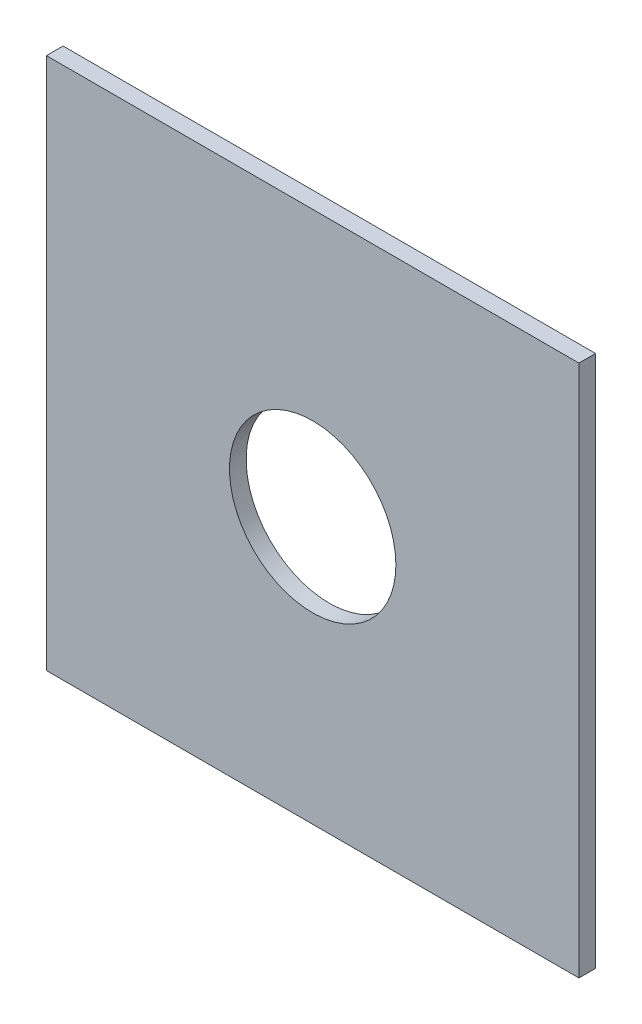
ISO-10303-21;
HEADER;
FILE_DESCRIPTION(('STEP AP214'),'2;1');
FILE_NAME('part.step','',(''),(''),'','','');
FILE_SCHEMA(('AUTOMOTIVE_DESIGN { 1 0 10303 214 1 1 1 1 }'));
ENDSEC;
DATA;
#1=APPLICATION_CONTEXT('core data for automotive mechanical design processes');
#2=APPLICATION_PROTOCOL_DEFINITION('international standard','automotive_design',2000,#1);
#3=PRODUCT_CONTEXT('',#1,'mechanical');
#4=PRODUCT('Part','Part','',(#3));
#5=PRODUCT_RELATED_PRODUCT_CATEGORY('part','',(#4));
#6=PRODUCT_DEFINITION_FORMATION('','',#4);
#7=PRODUCT_DEFINITION_CONTEXT('part definition',#1,'design');
#8=PRODUCT_DEFINITION('design','',#6,#7);
#9=PRODUCT_DEFINITION_SHAPE('','',#8);
#10=(LENGTH_UNIT() NAMED_UNIT(*) SI_UNIT(.MILLI.,.METRE.));
#11=(NAMED_UNIT(*) PLANE_ANGLE_UNIT() SI_UNIT($,.RADIAN.));
#12=(NAMED_UNIT(*) SI_UNIT($,.STERADIAN.) SOLID_ANGLE_UNIT());
#13=UNCERTAINTY_MEASURE_WITH_UNIT(LENGTH_MEASURE(1.E-05),#10,'distance_accuracy_value','');
#14=(GEOMETRIC_REPRESENTATION_CONTEXT(3) GLOBAL_UNCERTAINTY_ASSIGNED_CONTEXT((#13)) GLOBAL_UNIT_ASSIGNED_CONTEXT((#10,
#11,#12)) REPRESENTATION_CONTEXT('',''));
#15=CARTESIAN_POINT('',(0.,0.,0.));
#16=DIRECTION('',(0.,0.,1.));
#17=DIRECTION('',(1.,0.,0.));
#18=AXIS2_PLACEMENT_3D('',#15,#16,#17);
#19=CARTESIAN_POINT('',(80.,80.,5.));
#20=DIRECTION('',(-1.,0.,0.));
#21=DIRECTION('',(0.,0.,1.));
#22=AXIS2_PLACEMENT_3D('',#19,#20,#21);
#23=PLANE('',#22);
#24=DIRECTION('',(0.,1.,0.));
#25=VECTOR('',#24,1.);
#26=CARTESIAN_POINT('',(80.,80.,0.));
#27=LINE('',#26,#25);
#28=CARTESIAN_POINT('',(80.,-80.,0.));
#29=VERTEX_POINT('',#28);
#30=CARTESIAN_POINT('',(80.,80.,0.));
#31=VERTEX_POINT('',#30);
#32=EDGE_CURVE('E115',#29,#31,#27,.T.);
#33=ORIENTED_EDGE('',*,*,#32,.T.);
#34=DIRECTION('',(0.,0.,-1.));
#35=VECTOR('',#34,1.);
#36=CARTESIAN_POINT('',(80.,80.,5.));
#37=LINE('',#36,#35);
#38=CARTESIAN_POINT('',(80.,80.,5.));
#39=VERTEX_POINT('',#38);
#40=EDGE_CURVE('E11',#39,#31,#37,.T.);
#41=ORIENTED_EDGE('',*,*,#40,.F.);
#42=DIRECTION('',(0.,1.,0.));
#43=VECTOR('',#42,1.);
#44=CARTESIAN_POINT('',(80.,80.,5.));
#45=LINE('',#44,#43);
#46=CARTESIAN_POINT('',(80.,-80.,5.));
#47=VERTEX_POINT('',#46);
#48=EDGE_CURVE('E98',#47,#39,#45,.T.);
#49=ORIENTED_EDGE('',*,*,#48,.F.);
#50=DIRECTION('',(0.,0.,-1.));
#51=VECTOR('',#50,1.);
#52=CARTESIAN_POINT('',(80.,-80.,5.));
#53=LINE('',#52,#51);
#54=EDGE_CURVE('E111',#47,#29,#53,.T.);
#55=ORIENTED_EDGE('',*,*,#54,.T.);
#56=EDGE_LOOP('',(#33,#41,#49,#55));
#57=FACE_BOUND('',#56,.T.);
#58=ADVANCED_FACE('F45',(#57),#23,.F.);
#59=CARTESIAN_POINT('',(-80.,80.,5.));
#60=DIRECTION('',(0.,-1.,0.));
#61=DIRECTION('',(0.,0.,-1.));
#62=AXIS2_PLACEMENT_3D('',#59,#60,#61);
#63=PLANE('',#62);
#64=DIRECTION('',(-1.,0.,0.));
#65=VECTOR('',#64,1.);
#66=CARTESIAN_POINT('',(-80.,80.,0.));
#67=LINE('',#66,#65);
#68=CARTESIAN_POINT('',(-80.,80.,0.));
#69=VERTEX_POINT('',#68);
#70=EDGE_CURVE('E103',#31,#69,#67,.T.);
#71=ORIENTED_EDGE('',*,*,#70,.T.);
#72=DIRECTION('',(0.,0.,-1.));
#73=VECTOR('',#72,1.);
#74=CARTESIAN_POINT('',(-80.,80.,5.));
#75=LINE('',#74,#73);
#76=CARTESIAN_POINT('',(-80.,80.,5.));
#77=VERTEX_POINT('',#76);
#78=EDGE_CURVE('E55',#77,#69,#75,.T.);
#79=ORIENTED_EDGE('',*,*,#78,.F.);
#80=DIRECTION('',(-1.,0.,0.));
#81=VECTOR('',#80,1.);
#82=CARTESIAN_POINT('',(-80.,80.,5.));
#83=LINE('',#82,#81);
#84=EDGE_CURVE('E93',#39,#77,#83,.T.);
#85=ORIENTED_EDGE('',*,*,#84,.F.);
#86=ORIENTED_EDGE('',*,*,#40,.T.);
#87=EDGE_LOOP('',(#71,#79,#85,#86));
#88=FACE_BOUND('',#87,.T.);
#89=ADVANCED_FACE('F102',(#88),#63,.F.);
#90=CARTESIAN_POINT('',(-80.,80.,5.));
#91=DIRECTION('',(1.,0.,0.));
#92=DIRECTION('',(0.,1.,0.));
#93=AXIS2_PLACEMENT_3D('',#90,#91,#92);
#94=PLANE('',#93);
#95=DIRECTION('',(0.,-1.,0.));
#96=VECTOR('',#95,1.);
#97=CARTESIAN_POINT('',(-80.,80.,0.));
#98=LINE('',#97,#96);
#99=CARTESIAN_POINT('',(-80.,-80.,0.));
#100=VERTEX_POINT('',#99);
#101=EDGE_CURVE('E80',#69,#100,#98,.T.);
#102=ORIENTED_EDGE('',*,*,#101,.T.);
#103=DIRECTION('',(0.,0.,-1.));
#104=VECTOR('',#103,1.);
#105=CARTESIAN_POINT('',(-80.,-80.,5.));
#106=LINE('',#105,#104);
#107=CARTESIAN_POINT('',(-80.,-80.,5.));
#108=VERTEX_POINT('',#107);
#109=EDGE_CURVE('E105',#108,#100,#106,.T.);
#110=ORIENTED_EDGE('',*,*,#109,.F.);
#111=DIRECTION('',(0.,-1.,0.));
#112=VECTOR('',#111,1.);
#113=CARTESIAN_POINT('',(-80.,80.,5.));
#114=LINE('',#113,#112);
#115=EDGE_CURVE('E96',#77,#108,#114,.T.);
#116=ORIENTED_EDGE('',*,*,#115,.F.);
#117=ORIENTED_EDGE('',*,*,#78,.T.);
#118=EDGE_LOOP('',(#102,#110,#116,#117));
#119=FACE_BOUND('',#118,.T.);
#120=ADVANCED_FACE('F107',(#119),#94,.F.);
#121=CARTESIAN_POINT('',(-80.,-80.,5.));
#122=DIRECTION('',(0.,1.,0.));
#123=DIRECTION('',(0.,0.,1.));
#124=AXIS2_PLACEMENT_3D('',#121,#122,#123);
#125=PLANE('',#124);
#126=DIRECTION('',(1.,0.,0.));
#127=VECTOR('',#126,1.);
#128=CARTESIAN_POINT('',(-80.,-80.,0.));
#129=LINE('',#128,#127);
#130=EDGE_CURVE('E86',#100,#29,#129,.T.);
#131=ORIENTED_EDGE('',*,*,#130,.T.);
#132=ORIENTED_EDGE('',*,*,#54,.F.);
#133=DIRECTION('',(1.,0.,0.));
#134=VECTOR('',#133,1.);
#135=CARTESIAN_POINT('',(-80.,-80.,5.));
#136=LINE('',#135,#134);
#137=EDGE_CURVE('E63',#108,#47,#136,.T.);
#138=ORIENTED_EDGE('',*,*,#137,.F.);
#139=ORIENTED_EDGE('',*,*,#109,.T.);
#140=EDGE_LOOP('',(#131,#132,#138,#139));
#141=FACE_BOUND('',#140,.T.);
#142=ADVANCED_FACE('F128',(#141),#125,.F.);
#143=CARTESIAN_POINT('',(0.,0.,5.));
#144=DIRECTION('',(0.,0.,1.));
#145=DIRECTION('',(1.,0.,0.));
#146=AXIS2_PLACEMENT_3D('',#143,#144,#145);
#147=PLANE('',#146);
#148=CARTESIAN_POINT('',(0.,0.,5.));
#149=DIRECTION('',(0.,0.,1.));
#150=DIRECTION('',(1.,0.,0.));
#151=AXIS2_PLACEMENT_3D('',#148,#149,#150);
#152=CIRCLE('',#151,25.);
#153=CARTESIAN_POINT('',(25.,0.,5.));
#154=VERTEX_POINT('',#153);
#155=EDGE_CURVE('E135',#154,#154,#152,.T.);
#156=ORIENTED_EDGE('',*,*,#155,.F.);
#157=EDGE_LOOP('',(#156));
#158=FACE_BOUND('',#157,.T.);
#159=ORIENTED_EDGE('',*,*,#48,.T.);
#160=ORIENTED_EDGE('',*,*,#84,.T.);
#161=ORIENTED_EDGE('',*,*,#115,.T.);
#162=ORIENTED_EDGE('',*,*,#137,.T.);
#163=EDGE_LOOP('',(#159,#160,#161,#162));
#164=FACE_BOUND('',#163,.T.);
#165=ADVANCED_FACE('F94',(#158,#164),#147,.T.);
#166=CARTESIAN_POINT('',(0.,0.,0.));
#167=DIRECTION('',(0.,0.,1.));
#168=DIRECTION('',(1.,0.,0.));
#169=AXIS2_PLACEMENT_3D('',#166,#167,#168);
#170=PLANE('',#169);
#171=CARTESIAN_POINT('',(0.,0.,0.));
#172=DIRECTION('',(0.,0.,1.));
#173=DIRECTION('',(1.,0.,0.));
#174=AXIS2_PLACEMENT_3D('',#171,#172,#173);
#175=CIRCLE('',#174,25.);
#176=CARTESIAN_POINT('',(25.,0.,0.));
#177=VERTEX_POINT('',#176);
#178=EDGE_CURVE('E48',#177,#177,#175,.T.);
#179=ORIENTED_EDGE('',*,*,#178,.T.);
#180=EDGE_LOOP('',(#179));
#181=FACE_BOUND('',#180,.T.);
#182=ORIENTED_EDGE('',*,*,#32,.F.);
#183=ORIENTED_EDGE('',*,*,#130,.F.);
#184=ORIENTED_EDGE('',*,*,#101,.F.);
#185=ORIENTED_EDGE('',*,*,#70,.F.);
#186=EDGE_LOOP('',(#182,#183,#184,#185));
#187=FACE_BOUND('',#186,.T.);
#188=ADVANCED_FACE('F131',(#181,#187),#170,.F.);
#189=CARTESIAN_POINT('',(0.,0.,-5.));
#190=DIRECTION('',(0.,0.,1.));
#191=DIRECTION('',(1.,0.,0.));
#192=AXIS2_PLACEMENT_3D('',#189,#190,#191);
#193=CYLINDRICAL_SURFACE('',#192,25.);
#194=ORIENTED_EDGE('',*,*,#155,.T.);
#195=EDGE_LOOP('',(#194));
#196=FACE_BOUND('',#195,.T.);
#197=ORIENTED_EDGE('',*,*,#178,.F.);
#198=EDGE_LOOP('',(#197));
#199=FACE_BOUND('',#198,.T.);
#200=ADVANCED_FACE('F145',(#196,#199),#193,.F.);
#201=CLOSED_SHELL('',(#58,#89,#120,#142,#165,#188,#200));
#202=MANIFOLD_SOLID_BREP('B2',#201);
#203=ADVANCED_BREP_SHAPE_REPRESENTATION('',(#18,#202),#14);
#204=SHAPE_DEFINITION_REPRESENTATION(#9,#203);
ENDSEC;
END-ISO-10303-21;
